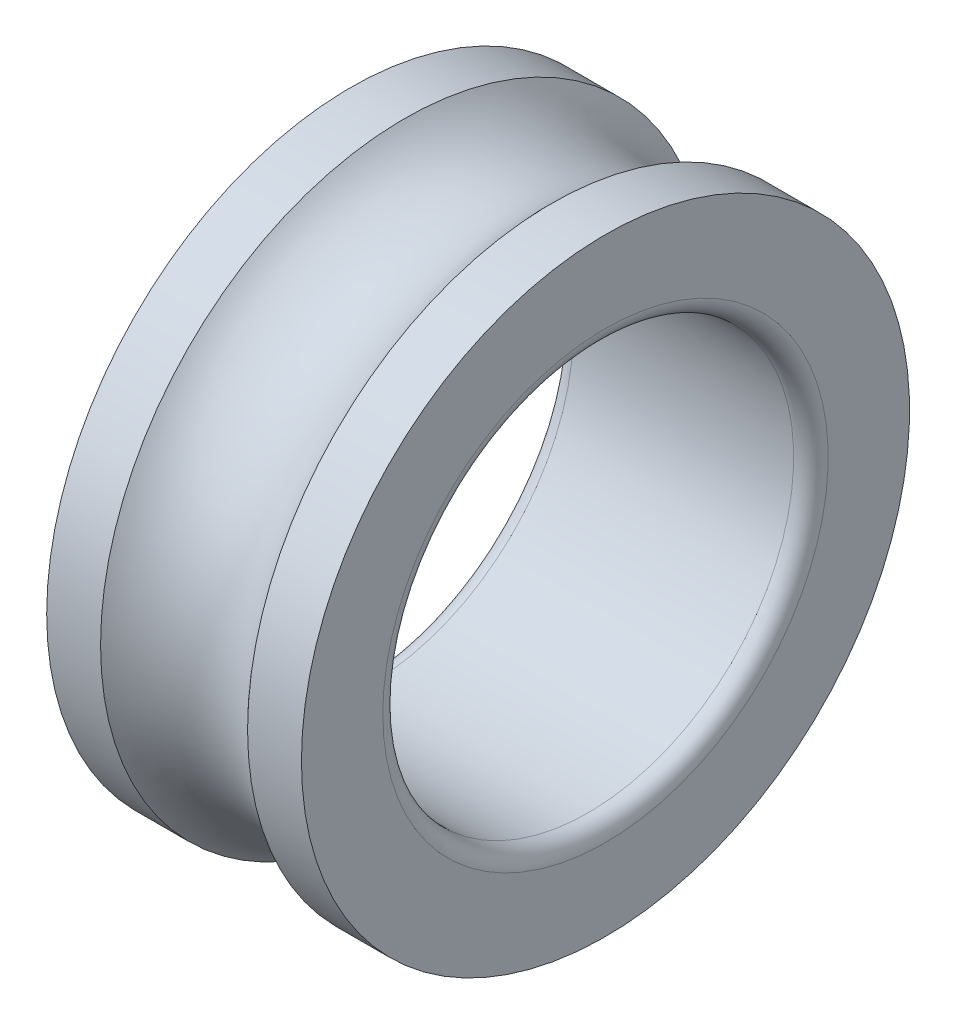
ISO-10303-21;
HEADER;
FILE_DESCRIPTION(('STEP AP214'),'2;1');
FILE_NAME('part.step','',(''),(''),'','','');
FILE_SCHEMA(('AUTOMOTIVE_DESIGN { 1 0 10303 214 1 1 1 1 }'));
ENDSEC;
DATA;
#1=APPLICATION_CONTEXT('core data for automotive mechanical design processes');
#2=APPLICATION_PROTOCOL_DEFINITION('international standard','automotive_design',2000,#1);
#3=PRODUCT_CONTEXT('',#1,'mechanical');
#4=PRODUCT('Part','Part','',(#3));
#5=PRODUCT_RELATED_PRODUCT_CATEGORY('part','',(#4));
#6=PRODUCT_DEFINITION_FORMATION('','',#4);
#7=PRODUCT_DEFINITION_CONTEXT('part definition',#1,'design');
#8=PRODUCT_DEFINITION('design','',#6,#7);
#9=PRODUCT_DEFINITION_SHAPE('','',#8);
#10=(LENGTH_UNIT() NAMED_UNIT(*) SI_UNIT(.MILLI.,.METRE.));
#11=(NAMED_UNIT(*) PLANE_ANGLE_UNIT() SI_UNIT($,.RADIAN.));
#12=(NAMED_UNIT(*) SI_UNIT($,.STERADIAN.) SOLID_ANGLE_UNIT());
#13=UNCERTAINTY_MEASURE_WITH_UNIT(LENGTH_MEASURE(1.E-05),#10,'distance_accuracy_value','');
#14=(GEOMETRIC_REPRESENTATION_CONTEXT(3) GLOBAL_UNCERTAINTY_ASSIGNED_CONTEXT((#13)) GLOBAL_UNIT_ASSIGNED_CONTEXT((#10,
#11,#12)) REPRESENTATION_CONTEXT('',''));
#15=CARTESIAN_POINT('',(0.,0.,0.));
#16=DIRECTION('',(0.,0.,1.));
#17=DIRECTION('',(1.,0.,0.));
#18=AXIS2_PLACEMENT_3D('',#15,#16,#17);
#19=CARTESIAN_POINT('',(-7.75,18.5,0.));
#20=DIRECTION('',(1.,0.,0.));
#21=DIRECTION('',(0.,0.,-1.));
#22=AXIS2_PLACEMENT_3D('',#19,#20,#21);
#23=PLANE('',#22);
#24=CARTESIAN_POINT('',(-7.75,0.,0.));
#25=DIRECTION('',(-1.,0.,0.));
#26=DIRECTION('',(0.,0.,1.));
#27=AXIS2_PLACEMENT_3D('',#24,#25,#26);
#28=CIRCLE('',#27,13.55);
#29=CARTESIAN_POINT('',(-7.75,0.,13.55));
#30=VERTEX_POINT('',#29);
#31=EDGE_CURVE('E10',#30,#30,#28,.T.);
#32=ORIENTED_EDGE('',*,*,#31,.F.);
#33=EDGE_LOOP('',(#32));
#34=FACE_BOUND('',#33,.T.);
#35=CARTESIAN_POINT('',(-7.75,0.,0.));
#36=DIRECTION('',(-1.,0.,0.));
#37=DIRECTION('',(0.,0.,1.));
#38=AXIS2_PLACEMENT_3D('',#35,#36,#37);
#39=CIRCLE('',#38,18.5);
#40=CARTESIAN_POINT('',(-7.75,0.,18.5));
#41=VERTEX_POINT('',#40);
#42=EDGE_CURVE('E69',#41,#41,#39,.T.);
#43=ORIENTED_EDGE('',*,*,#42,.T.);
#44=EDGE_LOOP('',(#43));
#45=FACE_BOUND('',#44,.T.);
#46=ADVANCED_FACE('F41',(#34,#45),#23,.F.);
#47=CARTESIAN_POINT('',(-6.7,0.,0.));
#48=DIRECTION('',(-1.,0.,0.));
#49=DIRECTION('',(0.,0.,1.));
#50=AXIS2_PLACEMENT_3D('',#47,#48,#49);
#51=TOROIDAL_SURFACE('',#50,13.55,1.05);
#52=CARTESIAN_POINT('',(-6.69999999999999,0.,0.));
#53=DIRECTION('',(-1.,0.,0.));
#54=DIRECTION('',(0.,0.,1.));
#55=AXIS2_PLACEMENT_3D('',#52,#53,#54);
#56=CIRCLE('',#55,12.5);
#57=CARTESIAN_POINT('',(-6.69999999999999,0.,12.5));
#58=VERTEX_POINT('',#57);
#59=EDGE_CURVE('E47',#58,#58,#56,.T.);
#60=ORIENTED_EDGE('',*,*,#59,.F.);
#61=EDGE_LOOP('',(#60));
#62=FACE_BOUND('',#61,.T.);
#63=ORIENTED_EDGE('',*,*,#31,.T.);
#64=EDGE_LOOP('',(#63));
#65=FACE_BOUND('',#64,.T.);
#66=ADVANCED_FACE('F106',(#62,#65),#51,.T.);
#67=CARTESIAN_POINT('',(0.,0.,0.));
#68=DIRECTION('',(-1.,0.,0.));
#69=DIRECTION('',(0.,0.,1.));
#70=AXIS2_PLACEMENT_3D('',#67,#68,#69);
#71=CYLINDRICAL_SURFACE('',#70,12.5);
#72=CARTESIAN_POINT('',(6.69999999999999,0.,0.));
#73=DIRECTION('',(-1.,0.,0.));
#74=DIRECTION('',(0.,0.,1.));
#75=AXIS2_PLACEMENT_3D('',#72,#73,#74);
#76=CIRCLE('',#75,12.5);
#77=CARTESIAN_POINT('',(6.69999999999999,0.,12.5));
#78=VERTEX_POINT('',#77);
#79=EDGE_CURVE('E51',#78,#78,#76,.T.);
#80=ORIENTED_EDGE('',*,*,#79,.F.);
#81=EDGE_LOOP('',(#80));
#82=FACE_BOUND('',#81,.T.);
#83=ORIENTED_EDGE('',*,*,#59,.T.);
#84=EDGE_LOOP('',(#83));
#85=FACE_BOUND('',#84,.T.);
#86=ADVANCED_FACE('F101',(#82,#85),#71,.F.);
#87=CARTESIAN_POINT('',(6.7,0.,0.));
#88=DIRECTION('',(-1.,0.,0.));
#89=DIRECTION('',(0.,0.,1.));
#90=AXIS2_PLACEMENT_3D('',#87,#88,#89);
#91=TOROIDAL_SURFACE('',#90,13.55,1.05);
#92=CARTESIAN_POINT('',(7.75,0.,0.));
#93=DIRECTION('',(-1.,0.,0.));
#94=DIRECTION('',(0.,0.,1.));
#95=AXIS2_PLACEMENT_3D('',#92,#93,#94);
#96=CIRCLE('',#95,13.55);
#97=CARTESIAN_POINT('',(7.75,0.,13.55));
#98=VERTEX_POINT('',#97);
#99=EDGE_CURVE('E55',#98,#98,#96,.T.);
#100=ORIENTED_EDGE('',*,*,#99,.F.);
#101=EDGE_LOOP('',(#100));
#102=FACE_BOUND('',#101,.T.);
#103=ORIENTED_EDGE('',*,*,#79,.T.);
#104=EDGE_LOOP('',(#103));
#105=FACE_BOUND('',#104,.T.);
#106=ADVANCED_FACE('F95',(#102,#105),#91,.T.);
#107=CARTESIAN_POINT('',(7.75,18.5,0.));
#108=DIRECTION('',(-1.,0.,0.));
#109=DIRECTION('',(0.,0.,1.));
#110=AXIS2_PLACEMENT_3D('',#107,#108,#109);
#111=PLANE('',#110);
#112=CARTESIAN_POINT('',(7.75,0.,0.));
#113=DIRECTION('',(-1.,0.,0.));
#114=DIRECTION('',(0.,0.,1.));
#115=AXIS2_PLACEMENT_3D('',#112,#113,#114);
#116=CIRCLE('',#115,18.5);
#117=CARTESIAN_POINT('',(7.75,0.,18.5));
#118=VERTEX_POINT('',#117);
#119=EDGE_CURVE('E60',#118,#118,#116,.T.);
#120=ORIENTED_EDGE('',*,*,#119,.F.);
#121=EDGE_LOOP('',(#120));
#122=FACE_BOUND('',#121,.T.);
#123=ORIENTED_EDGE('',*,*,#99,.T.);
#124=EDGE_LOOP('',(#123));
#125=FACE_BOUND('',#124,.T.);
#126=ADVANCED_FACE('F89',(#122,#125),#111,.F.);
#127=CARTESIAN_POINT('',(0.,0.,0.));
#128=DIRECTION('',(-1.,0.,0.));
#129=DIRECTION('',(0.,0.,1.));
#130=AXIS2_PLACEMENT_3D('',#127,#128,#129);
#131=CYLINDRICAL_SURFACE('',#130,18.5);
#132=CARTESIAN_POINT('',(4.47213595499958,0.,0.));
#133=DIRECTION('',(-1.,0.,0.));
#134=DIRECTION('',(0.,0.,1.));
#135=AXIS2_PLACEMENT_3D('',#132,#133,#134);
#136=CIRCLE('',#135,18.5);
#137=CARTESIAN_POINT('',(4.47213595499958,0.,18.5));
#138=VERTEX_POINT('',#137);
#139=EDGE_CURVE('E63',#138,#138,#136,.T.);
#140=ORIENTED_EDGE('',*,*,#139,.F.);
#141=EDGE_LOOP('',(#140));
#142=FACE_BOUND('',#141,.T.);
#143=ORIENTED_EDGE('',*,*,#119,.T.);
#144=EDGE_LOOP('',(#143));
#145=FACE_BOUND('',#144,.T.);
#146=ADVANCED_FACE('F83',(#142,#145),#131,.T.);
#147=CARTESIAN_POINT('',(0.,0.,0.));
#148=DIRECTION('',(-1.,0.,0.));
#149=DIRECTION('',(0.,0.,1.));
#150=AXIS2_PLACEMENT_3D('',#147,#148,#149);
#151=TOROIDAL_SURFACE('',#150,22.5,6.);
#152=CARTESIAN_POINT('',(-4.47213595499958,0.,0.));
#153=DIRECTION('',(-1.,0.,0.));
#154=DIRECTION('',(0.,0.,1.));
#155=AXIS2_PLACEMENT_3D('',#152,#153,#154);
#156=CIRCLE('',#155,18.5);
#157=CARTESIAN_POINT('',(-4.47213595499958,0.,18.5));
#158=VERTEX_POINT('',#157);
#159=EDGE_CURVE('E66',#158,#158,#156,.T.);
#160=ORIENTED_EDGE('',*,*,#159,.F.);
#161=EDGE_LOOP('',(#160));
#162=FACE_BOUND('',#161,.T.);
#163=ORIENTED_EDGE('',*,*,#139,.T.);
#164=EDGE_LOOP('',(#163));
#165=FACE_BOUND('',#164,.T.);
#166=ADVANCED_FACE('F77',(#162,#165),#151,.F.);
#167=CARTESIAN_POINT('',(0.,0.,0.));
#168=DIRECTION('',(-1.,0.,0.));
#169=DIRECTION('',(0.,0.,1.));
#170=AXIS2_PLACEMENT_3D('',#167,#168,#169);
#171=CYLINDRICAL_SURFACE('',#170,18.5);
#172=ORIENTED_EDGE('',*,*,#42,.F.);
#173=EDGE_LOOP('',(#172));
#174=FACE_BOUND('',#173,.T.);
#175=ORIENTED_EDGE('',*,*,#159,.T.);
#176=EDGE_LOOP('',(#175));
#177=FACE_BOUND('',#176,.T.);
#178=ADVANCED_FACE('F74',(#174,#177),#171,.T.);
#179=CLOSED_SHELL('',(#46,#66,#86,#106,#126,#146,#166,#178));
#180=MANIFOLD_SOLID_BREP('B2',#179);
#181=ADVANCED_BREP_SHAPE_REPRESENTATION('',(#18,#180),#14);
#182=SHAPE_DEFINITION_REPRESENTATION(#9,#181);
ENDSEC;
END-ISO-10303-21;
